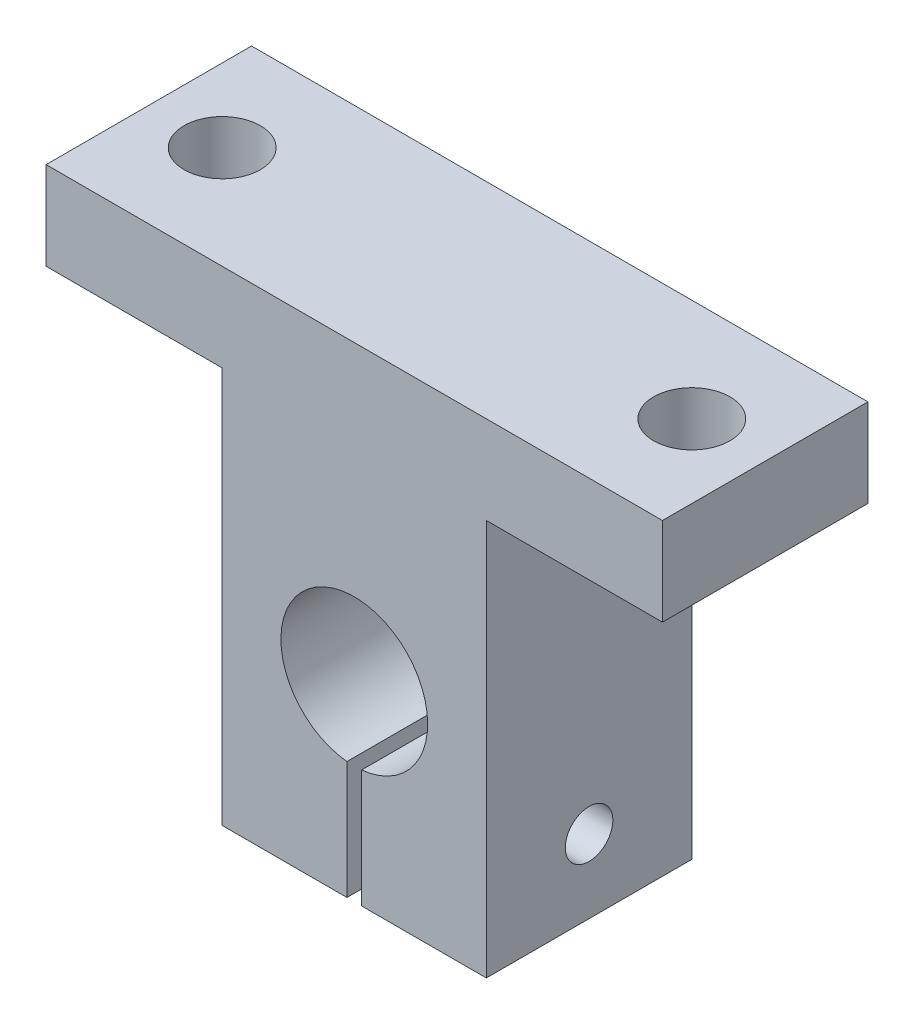
ISO-10303-21;
HEADER;
FILE_DESCRIPTION(('STEP AP214'),'2;1');
FILE_NAME('part.step','',(''),(''),'','','');
FILE_SCHEMA(('AUTOMOTIVE_DESIGN { 1 0 10303 214 1 1 1 1 }'));
ENDSEC;
DATA;
#1=APPLICATION_CONTEXT('core data for automotive mechanical design processes');
#2=APPLICATION_PROTOCOL_DEFINITION('international standard','automotive_design',2000,#1);
#3=PRODUCT_CONTEXT('',#1,'mechanical');
#4=PRODUCT('Part','Part','',(#3));
#5=PRODUCT_RELATED_PRODUCT_CATEGORY('part','',(#4));
#6=PRODUCT_DEFINITION_FORMATION('','',#4);
#7=PRODUCT_DEFINITION_CONTEXT('part definition',#1,'design');
#8=PRODUCT_DEFINITION('design','',#6,#7);
#9=PRODUCT_DEFINITION_SHAPE('','',#8);
#10=(LENGTH_UNIT() NAMED_UNIT(*) SI_UNIT(.MILLI.,.METRE.));
#11=(NAMED_UNIT(*) PLANE_ANGLE_UNIT() SI_UNIT($,.RADIAN.));
#12=(NAMED_UNIT(*) SI_UNIT($,.STERADIAN.) SOLID_ANGLE_UNIT());
#13=UNCERTAINTY_MEASURE_WITH_UNIT(LENGTH_MEASURE(1.E-05),#10,'distance_accuracy_value','');
#14=(GEOMETRIC_REPRESENTATION_CONTEXT(3) GLOBAL_UNCERTAINTY_ASSIGNED_CONTEXT((#13)) GLOBAL_UNIT_ASSIGNED_CONTEXT((#10,
#11,#12)) REPRESENTATION_CONTEXT('',''));
#15=CARTESIAN_POINT('',(0.,0.,0.));
#16=DIRECTION('',(0.,0.,1.));
#17=DIRECTION('',(1.,0.,0.));
#18=AXIS2_PLACEMENT_3D('',#15,#16,#17);
#19=CARTESIAN_POINT('',(-5.99999999999999,-28.,0.));
#20=DIRECTION('',(-1.,0.,0.));
#21=DIRECTION('',(0.,0.,1.));
#22=AXIS2_PLACEMENT_3D('',#19,#20,#21);
#23=PLANE('',#22);
#24=CARTESIAN_POINT('',(-5.99999999999999,-28.,0.));
#25=DIRECTION('',(1.,0.,0.));
#26=DIRECTION('',(0.,0.,-1.));
#27=AXIS2_PLACEMENT_3D('',#24,#25,#26);
#28=CIRCLE('',#27,2.1);
#29=CARTESIAN_POINT('',(-5.99999999999999,-28.,-2.09999999999999));
#30=VERTEX_POINT('',#29);
#31=EDGE_CURVE('E242',#30,#30,#28,.T.);
#32=ORIENTED_EDGE('',*,*,#31,.T.);
#33=EDGE_LOOP('',(#32));
#34=FACE_BOUND('',#33,.T.);
#35=CARTESIAN_POINT('',(-5.99999999999999,-28.,0.));
#36=DIRECTION('',(-1.,0.,0.));
#37=DIRECTION('',(0.,0.,1.));
#38=AXIS2_PLACEMENT_3D('',#35,#36,#37);
#39=CIRCLE('',#38,4.);
#40=CARTESIAN_POINT('',(-5.99999999999999,-28.,4.00000000000001));
#41=VERTEX_POINT('',#40);
#42=EDGE_CURVE('E311',#41,#41,#39,.T.);
#43=ORIENTED_EDGE('',*,*,#42,.T.);
#44=EDGE_LOOP('',(#43));
#45=FACE_BOUND('',#44,.T.);
#46=ADVANCED_FACE('F16',(#34,#45),#23,.T.);
#47=CARTESIAN_POINT('',(3.50000000000001,-28.,0.));
#48=DIRECTION('',(-1.,0.,0.));
#49=DIRECTION('',(0.,0.,1.));
#50=AXIS2_PLACEMENT_3D('',#47,#48,#49);
#51=CYLINDRICAL_SURFACE('',#50,1.621);
#52=CARTESIAN_POINT('',(9.00000000000001,-28.,0.));
#53=DIRECTION('',(-1.,0.,0.));
#54=DIRECTION('',(0.,0.,1.));
#55=AXIS2_PLACEMENT_3D('',#52,#53,#54);
#56=CIRCLE('',#55,1.621);
#57=CARTESIAN_POINT('',(9.00000000000001,-28.,1.62100000000001));
#58=VERTEX_POINT('',#57);
#59=EDGE_CURVE('E227',#58,#58,#56,.T.);
#60=ORIENTED_EDGE('',*,*,#59,.F.);
#61=EDGE_LOOP('',(#60));
#62=FACE_BOUND('',#61,.T.);
#63=CARTESIAN_POINT('',(0.499999999999995,-28.,0.));
#64=DIRECTION('',(-1.,0.,0.));
#65=DIRECTION('',(0.,0.,1.));
#66=AXIS2_PLACEMENT_3D('',#63,#64,#65);
#67=CIRCLE('',#66,1.621);
#68=CARTESIAN_POINT('',(0.499999999999995,-28.,1.62100000000001));
#69=VERTEX_POINT('',#68);
#70=EDGE_CURVE('E118',#69,#69,#67,.T.);
#71=ORIENTED_EDGE('',*,*,#70,.T.);
#72=EDGE_LOOP('',(#71));
#73=FACE_BOUND('',#72,.T.);
#74=ADVANCED_FACE('F511',(#62,#73),#51,.F.);
#75=CARTESIAN_POINT('',(16.,-1.99999999999999,0.));
#76=DIRECTION('',(0.,-1.,0.));
#77=DIRECTION('',(1.,0.,0.));
#78=AXIS2_PLACEMENT_3D('',#75,#76,#77);
#79=CYLINDRICAL_SURFACE('',#78,2.6);
#80=CARTESIAN_POINT('',(16.,-5.99999999999999,0.));
#81=DIRECTION('',(0.,-1.,0.));
#82=DIRECTION('',(1.,0.,0.));
#83=AXIS2_PLACEMENT_3D('',#80,#81,#82);
#84=CIRCLE('',#83,2.6);
#85=CARTESIAN_POINT('',(18.6,-5.99999999999999,0.));
#86=VERTEX_POINT('',#85);
#87=EDGE_CURVE('E216',#86,#86,#84,.F.);
#88=ORIENTED_EDGE('',*,*,#87,.F.);
#89=EDGE_LOOP('',(#88));
#90=FACE_BOUND('',#89,.T.);
#91=CARTESIAN_POINT('',(16.,0.,0.));
#92=DIRECTION('',(0.,-1.,0.));
#93=DIRECTION('',(1.,0.,0.));
#94=AXIS2_PLACEMENT_3D('',#91,#92,#93);
#95=CIRCLE('',#94,2.6);
#96=CARTESIAN_POINT('',(18.6,0.,0.));
#97=VERTEX_POINT('',#96);
#98=EDGE_CURVE('E193',#97,#97,#95,.T.);
#99=ORIENTED_EDGE('',*,*,#98,.F.);
#100=EDGE_LOOP('',(#99));
#101=FACE_BOUND('',#100,.T.);
#102=ADVANCED_FACE('F502',(#90,#101),#79,.F.);
#103=CARTESIAN_POINT('',(-16.,-2.,0.));
#104=DIRECTION('',(0.,-1.,0.));
#105=DIRECTION('',(1.,0.,0.));
#106=AXIS2_PLACEMENT_3D('',#103,#104,#105);
#107=CYLINDRICAL_SURFACE('',#106,2.6);
#108=CARTESIAN_POINT('',(-16.,-6.,0.));
#109=DIRECTION('',(0.,-1.,0.));
#110=DIRECTION('',(1.,0.,0.));
#111=AXIS2_PLACEMENT_3D('',#108,#109,#110);
#112=CIRCLE('',#111,2.6);
#113=CARTESIAN_POINT('',(-13.4,-6.,0.));
#114=VERTEX_POINT('',#113);
#115=EDGE_CURVE('E170',#114,#114,#112,.F.);
#116=ORIENTED_EDGE('',*,*,#115,.F.);
#117=EDGE_LOOP('',(#116));
#118=FACE_BOUND('',#117,.T.);
#119=CARTESIAN_POINT('',(-16.,0.,0.));
#120=DIRECTION('',(0.,-1.,0.));
#121=DIRECTION('',(1.,0.,0.));
#122=AXIS2_PLACEMENT_3D('',#119,#120,#121);
#123=CIRCLE('',#122,2.6);
#124=CARTESIAN_POINT('',(-13.4,0.,0.));
#125=VERTEX_POINT('',#124);
#126=EDGE_CURVE('E261',#125,#125,#123,.T.);
#127=ORIENTED_EDGE('',*,*,#126,.F.);
#128=EDGE_LOOP('',(#127));
#129=FACE_BOUND('',#128,.T.);
#130=ADVANCED_FACE('F321',(#118,#129),#107,.F.);
#131=CARTESIAN_POINT('',(-7.49999999999999,-28.,0.));
#132=DIRECTION('',(-1.,0.,0.));
#133=DIRECTION('',(0.,0.,1.));
#134=AXIS2_PLACEMENT_3D('',#131,#132,#133);
#135=CYLINDRICAL_SURFACE('',#134,4.);
#136=ORIENTED_EDGE('',*,*,#42,.F.);
#137=EDGE_LOOP('',(#136));
#138=FACE_BOUND('',#137,.T.);
#139=CARTESIAN_POINT('',(-8.99999999999999,-28.,0.));
#140=DIRECTION('',(-1.,0.,0.));
#141=DIRECTION('',(0.,0.,1.));
#142=AXIS2_PLACEMENT_3D('',#139,#140,#141);
#143=CIRCLE('',#142,4.);
#144=CARTESIAN_POINT('',(-8.99999999999999,-28.,4.00000000000001));
#145=VERTEX_POINT('',#144);
#146=EDGE_CURVE('E158',#145,#145,#143,.F.);
#147=ORIENTED_EDGE('',*,*,#146,.F.);
#148=EDGE_LOOP('',(#147));
#149=FACE_BOUND('',#148,.T.);
#150=ADVANCED_FACE('F317',(#138,#149),#135,.F.);
#151=CARTESIAN_POINT('',(-5.99999999999999,-28.,0.));
#152=DIRECTION('',(1.,0.,0.));
#153=DIRECTION('',(0.,0.,-1.));
#154=AXIS2_PLACEMENT_3D('',#151,#152,#153);
#155=CYLINDRICAL_SURFACE('',#154,2.1);
#156=CARTESIAN_POINT('',(-0.500000000000002,-28.,0.));
#157=DIRECTION('',(1.,0.,0.));
#158=DIRECTION('',(0.,0.,-1.));
#159=AXIS2_PLACEMENT_3D('',#156,#157,#158);
#160=CIRCLE('',#159,2.1);
#161=CARTESIAN_POINT('',(-0.500000000000002,-28.,-2.09999999999999));
#162=VERTEX_POINT('',#161);
#163=EDGE_CURVE('E145',#162,#162,#160,.T.);
#164=ORIENTED_EDGE('',*,*,#163,.T.);
#165=EDGE_LOOP('',(#164));
#166=FACE_BOUND('',#165,.T.);
#167=ORIENTED_EDGE('',*,*,#31,.F.);
#168=EDGE_LOOP('',(#167));
#169=FACE_BOUND('',#168,.T.);
#170=ADVANCED_FACE('F320',(#166,#169),#155,.F.);
#171=CARTESIAN_POINT('',(0.,-2.99999999999999,-7.));
#172=DIRECTION('',(0.,0.,-1.));
#173=DIRECTION('',(-1.,0.,0.));
#174=AXIS2_PLACEMENT_3D('',#171,#172,#173);
#175=PLANE('',#174);
#176=DIRECTION('',(0.,1.,0.));
#177=VECTOR('',#176,1.);
#178=CARTESIAN_POINT('',(9.00000000000001,-33.,-7.));
#179=LINE('',#178,#177);
#180=CARTESIAN_POINT('',(9.00000000000001,-33.,-7.));
#181=VERTEX_POINT('',#180);
#182=CARTESIAN_POINT('',(8.99999999999999,-5.99999999999999,-7.));
#183=VERTEX_POINT('',#182);
#184=EDGE_CURVE('E234',#181,#183,#179,.T.);
#185=ORIENTED_EDGE('',*,*,#184,.F.);
#186=DIRECTION('',(1.,0.,0.));
#187=VECTOR('',#186,1.);
#188=CARTESIAN_POINT('',(-8.99999999999999,-33.,-7.));
#189=LINE('',#188,#187);
#190=CARTESIAN_POINT('',(0.499999999999999,-33.,-7.));
#191=VERTEX_POINT('',#190);
#192=EDGE_CURVE('E117',#191,#181,#189,.T.);
#193=ORIENTED_EDGE('',*,*,#192,.F.);
#194=DIRECTION('',(0.,1.,0.));
#195=VECTOR('',#194,1.);
#196=CARTESIAN_POINT('',(0.499999999999995,-20.,-7.));
#197=LINE('',#196,#195);
#198=CARTESIAN_POINT('',(0.499999999999998,-24.9749371855331,-7.));
#199=VERTEX_POINT('',#198);
#200=EDGE_CURVE('E53',#191,#199,#197,.T.);
#201=ORIENTED_EDGE('',*,*,#200,.T.);
#202=CARTESIAN_POINT('',(0.,-20.,-7.));
#203=DIRECTION('',(0.,0.,-1.));
#204=DIRECTION('',(-1.,0.,0.));
#205=AXIS2_PLACEMENT_3D('',#202,#203,#204);
#206=CIRCLE('',#205,5.);
#207=CARTESIAN_POINT('',(-0.500000000000001,-24.9749371855331,-7.));
#208=VERTEX_POINT('',#207);
#209=EDGE_CURVE('E141',#199,#208,#206,.F.);
#210=ORIENTED_EDGE('',*,*,#209,.T.);
#211=DIRECTION('',(0.,-1.,0.));
#212=VECTOR('',#211,1.);
#213=CARTESIAN_POINT('',(-0.500000000000001,-33.,-7.));
#214=LINE('',#213,#212);
#215=CARTESIAN_POINT('',(-0.500000000000001,-33.,-7.));
#216=VERTEX_POINT('',#215);
#217=EDGE_CURVE('E59',#208,#216,#214,.T.);
#218=ORIENTED_EDGE('',*,*,#217,.T.);
#219=DIRECTION('',(1.,0.,0.));
#220=VECTOR('',#219,1.);
#221=CARTESIAN_POINT('',(-8.99999999999999,-33.,-7.));
#222=LINE('',#221,#220);
#223=CARTESIAN_POINT('',(-8.99999999999999,-33.,-7.));
#224=VERTEX_POINT('',#223);
#225=EDGE_CURVE('E157',#224,#216,#222,.T.);
#226=ORIENTED_EDGE('',*,*,#225,.F.);
#227=DIRECTION('',(0.,1.,0.));
#228=VECTOR('',#227,1.);
#229=CARTESIAN_POINT('',(-8.99999999999999,-6.,-7.));
#230=LINE('',#229,#228);
#231=CARTESIAN_POINT('',(-8.99999999999999,-6.,-7.));
#232=VERTEX_POINT('',#231);
#233=EDGE_CURVE('E169',#232,#224,#230,.F.);
#234=ORIENTED_EDGE('',*,*,#233,.F.);
#235=DIRECTION('',(1.,0.,0.));
#236=VECTOR('',#235,1.);
#237=CARTESIAN_POINT('',(-21.,-6.,-7.));
#238=LINE('',#237,#236);
#239=CARTESIAN_POINT('',(-21.,-6.,-7.));
#240=VERTEX_POINT('',#239);
#241=EDGE_CURVE('E181',#240,#232,#238,.T.);
#242=ORIENTED_EDGE('',*,*,#241,.F.);
#243=DIRECTION('',(0.,1.,0.));
#244=VECTOR('',#243,1.);
#245=CARTESIAN_POINT('',(-21.,0.,-7.));
#246=LINE('',#245,#244);
#247=CARTESIAN_POINT('',(-21.,0.,-7.));
#248=VERTEX_POINT('',#247);
#249=EDGE_CURVE('E182',#248,#240,#246,.F.);
#250=ORIENTED_EDGE('',*,*,#249,.F.);
#251=DIRECTION('',(-1.,0.,0.));
#252=VECTOR('',#251,1.);
#253=CARTESIAN_POINT('',(21.,0.,-7.));
#254=LINE('',#253,#252);
#255=CARTESIAN_POINT('',(21.,0.,-7.));
#256=VERTEX_POINT('',#255);
#257=EDGE_CURVE('E204',#256,#248,#254,.T.);
#258=ORIENTED_EDGE('',*,*,#257,.F.);
#259=DIRECTION('',(0.,1.,0.));
#260=VECTOR('',#259,1.);
#261=CARTESIAN_POINT('',(21.,-5.99999999999999,-7.));
#262=LINE('',#261,#260);
#263=CARTESIAN_POINT('',(21.,-5.99999999999999,-7.));
#264=VERTEX_POINT('',#263);
#265=EDGE_CURVE('E205',#264,#256,#262,.T.);
#266=ORIENTED_EDGE('',*,*,#265,.F.);
#267=DIRECTION('',(1.,0.,0.));
#268=VECTOR('',#267,1.);
#269=CARTESIAN_POINT('',(-21.,-6.,-7.));
#270=LINE('',#269,#268);
#271=EDGE_CURVE('E226',#183,#264,#270,.T.);
#272=ORIENTED_EDGE('',*,*,#271,.F.);
#273=EDGE_LOOP('',(#185,#193,#201,#210,#218,#226,#234,#242,#250,#258,#266,#272));
#274=FACE_BOUND('',#273,.T.);
#275=ADVANCED_FACE('F338',(#274),#175,.T.);
#276=CARTESIAN_POINT('',(0.499999999999995,-20.,7.));
#277=DIRECTION('',(1.,0.,0.));
#278=DIRECTION('',(0.,1.,0.));
#279=AXIS2_PLACEMENT_3D('',#276,#277,#278);
#280=PLANE('',#279);
#281=ORIENTED_EDGE('',*,*,#70,.F.);
#282=EDGE_LOOP('',(#281));
#283=FACE_BOUND('',#282,.T.);
#284=ORIENTED_EDGE('',*,*,#200,.F.);
#285=DIRECTION('',(0.,0.,1.));
#286=VECTOR('',#285,1.);
#287=CARTESIAN_POINT('',(0.499999999999999,-33.,0.));
#288=LINE('',#287,#286);
#289=CARTESIAN_POINT('',(0.499999999999998,-33.,7.));
#290=VERTEX_POINT('',#289);
#291=EDGE_CURVE('E110',#290,#191,#288,.F.);
#292=ORIENTED_EDGE('',*,*,#291,.F.);
#293=DIRECTION('',(0.,1.,0.));
#294=VECTOR('',#293,1.);
#295=CARTESIAN_POINT('',(0.499999999999997,-2.99999999999999,7.));
#296=LINE('',#295,#294);
#297=CARTESIAN_POINT('',(0.499999999999998,-24.9749371855331,7.));
#298=VERTEX_POINT('',#297);
#299=EDGE_CURVE('E114',#298,#290,#296,.F.);
#300=ORIENTED_EDGE('',*,*,#299,.F.);
#301=DIRECTION('',(0.,0.,-1.));
#302=VECTOR('',#301,1.);
#303=CARTESIAN_POINT('',(0.499999999999999,-24.9749371855331,7.));
#304=LINE('',#303,#302);
#305=EDGE_CURVE('E132',#298,#199,#304,.T.);
#306=ORIENTED_EDGE('',*,*,#305,.T.);
#307=EDGE_LOOP('',(#284,#292,#300,#306));
#308=FACE_BOUND('',#307,.T.);
#309=ADVANCED_FACE('F112',(#283,#308),#280,.F.);
#310=CARTESIAN_POINT('',(-8.99999999999999,-33.,0.));
#311=DIRECTION('',(0.,-1.,0.));
#312=DIRECTION('',(1.,0.,0.));
#313=AXIS2_PLACEMENT_3D('',#310,#311,#312);
#314=PLANE('',#313);
#315=DIRECTION('',(0.,0.,1.));
#316=VECTOR('',#315,1.);
#317=CARTESIAN_POINT('',(9.00000000000001,-33.,0.));
#318=LINE('',#317,#316);
#319=CARTESIAN_POINT('',(9.00000000000001,-33.,7.));
#320=VERTEX_POINT('',#319);
#321=EDGE_CURVE('E124',#320,#181,#318,.F.);
#322=ORIENTED_EDGE('',*,*,#321,.F.);
#323=DIRECTION('',(1.,0.,0.));
#324=VECTOR('',#323,1.);
#325=CARTESIAN_POINT('',(0.,-33.,7.));
#326=LINE('',#325,#324);
#327=EDGE_CURVE('E121',#290,#320,#326,.T.);
#328=ORIENTED_EDGE('',*,*,#327,.F.);
#329=ORIENTED_EDGE('',*,*,#291,.T.);
#330=ORIENTED_EDGE('',*,*,#192,.T.);
#331=EDGE_LOOP('',(#322,#328,#329,#330));
#332=FACE_BOUND('',#331,.T.);
#333=ADVANCED_FACE('F122',(#332),#314,.T.);
#334=CARTESIAN_POINT('',(9.00000000000001,-33.,0.));
#335=DIRECTION('',(1.,0.,0.));
#336=DIRECTION('',(0.,1.,0.));
#337=AXIS2_PLACEMENT_3D('',#334,#335,#336);
#338=PLANE('',#337);
#339=ORIENTED_EDGE('',*,*,#59,.T.);
#340=EDGE_LOOP('',(#339));
#341=FACE_BOUND('',#340,.T.);
#342=ORIENTED_EDGE('',*,*,#321,.T.);
#343=ORIENTED_EDGE('',*,*,#184,.T.);
#344=DIRECTION('',(0.,0.,1.));
#345=VECTOR('',#344,1.);
#346=CARTESIAN_POINT('',(8.99999999999999,-5.99999999999999,0.));
#347=LINE('',#346,#345);
#348=CARTESIAN_POINT('',(9.00000000000001,-5.99999999999999,7.));
#349=VERTEX_POINT('',#348);
#350=EDGE_CURVE('E223',#349,#183,#347,.F.);
#351=ORIENTED_EDGE('',*,*,#350,.F.);
#352=DIRECTION('',(0.,1.,0.));
#353=VECTOR('',#352,1.);
#354=CARTESIAN_POINT('',(9.00000000000001,-2.99999999999999,7.));
#355=LINE('',#354,#353);
#356=EDGE_CURVE('E128',#320,#349,#355,.T.);
#357=ORIENTED_EDGE('',*,*,#356,.F.);
#358=EDGE_LOOP('',(#342,#343,#351,#357));
#359=FACE_BOUND('',#358,.T.);
#360=ADVANCED_FACE('F358',(#341,#359),#338,.T.);
#361=CARTESIAN_POINT('',(-21.,-6.,0.));
#362=DIRECTION('',(0.,-1.,0.));
#363=DIRECTION('',(1.,0.,0.));
#364=AXIS2_PLACEMENT_3D('',#361,#362,#363);
#365=PLANE('',#364);
#366=ORIENTED_EDGE('',*,*,#87,.T.);
#367=EDGE_LOOP('',(#366));
#368=FACE_BOUND('',#367,.T.);
#369=DIRECTION('',(0.,0.,-1.));
#370=VECTOR('',#369,1.);
#371=CARTESIAN_POINT('',(21.,-5.99999999999999,0.));
#372=LINE('',#371,#370);
#373=CARTESIAN_POINT('',(21.,-5.99999999999999,7.));
#374=VERTEX_POINT('',#373);
#375=EDGE_CURVE('E213',#374,#264,#372,.T.);
#376=ORIENTED_EDGE('',*,*,#375,.F.);
#377=DIRECTION('',(1.,0.,0.));
#378=VECTOR('',#377,1.);
#379=CARTESIAN_POINT('',(0.,-5.99999999999999,7.));
#380=LINE('',#379,#378);
#381=EDGE_CURVE('E210',#349,#374,#380,.T.);
#382=ORIENTED_EDGE('',*,*,#381,.F.);
#383=ORIENTED_EDGE('',*,*,#350,.T.);
#384=ORIENTED_EDGE('',*,*,#271,.T.);
#385=EDGE_LOOP('',(#376,#382,#383,#384));
#386=FACE_BOUND('',#385,.T.);
#387=ADVANCED_FACE('F356',(#368,#386),#365,.T.);
#388=CARTESIAN_POINT('',(21.,-5.99999999999999,0.));
#389=DIRECTION('',(1.,0.,0.));
#390=DIRECTION('',(0.,0.,-1.));
#391=AXIS2_PLACEMENT_3D('',#388,#389,#390);
#392=PLANE('',#391);
#393=ORIENTED_EDGE('',*,*,#375,.T.);
#394=ORIENTED_EDGE('',*,*,#265,.T.);
#395=DIRECTION('',(0.,0.,1.));
#396=VECTOR('',#395,1.);
#397=CARTESIAN_POINT('',(21.,0.,0.));
#398=LINE('',#397,#396);
#399=CARTESIAN_POINT('',(21.,0.,7.));
#400=VERTEX_POINT('',#399);
#401=EDGE_CURVE('E201',#400,#256,#398,.F.);
#402=ORIENTED_EDGE('',*,*,#401,.F.);
#403=DIRECTION('',(0.,1.,0.));
#404=VECTOR('',#403,1.);
#405=CARTESIAN_POINT('',(21.,-2.99999999999999,7.));
#406=LINE('',#405,#404);
#407=EDGE_CURVE('E198',#374,#400,#406,.T.);
#408=ORIENTED_EDGE('',*,*,#407,.F.);
#409=EDGE_LOOP('',(#393,#394,#402,#408));
#410=FACE_BOUND('',#409,.T.);
#411=ADVANCED_FACE('F353',(#410),#392,.T.);
#412=CARTESIAN_POINT('',(21.,0.,0.));
#413=DIRECTION('',(0.,1.,0.));
#414=DIRECTION('',(-1.,0.,0.));
#415=AXIS2_PLACEMENT_3D('',#412,#413,#414);
#416=PLANE('',#415);
#417=ORIENTED_EDGE('',*,*,#98,.T.);
#418=EDGE_LOOP('',(#417));
#419=FACE_BOUND('',#418,.T.);
#420=ORIENTED_EDGE('',*,*,#126,.T.);
#421=EDGE_LOOP('',(#420));
#422=FACE_BOUND('',#421,.T.);
#423=ORIENTED_EDGE('',*,*,#401,.T.);
#424=ORIENTED_EDGE('',*,*,#257,.T.);
#425=DIRECTION('',(0.,0.,1.));
#426=VECTOR('',#425,1.);
#427=CARTESIAN_POINT('',(-21.,0.,0.));
#428=LINE('',#427,#426);
#429=CARTESIAN_POINT('',(-21.,0.,7.));
#430=VERTEX_POINT('',#429);
#431=EDGE_CURVE('E190',#430,#248,#428,.F.);
#432=ORIENTED_EDGE('',*,*,#431,.F.);
#433=DIRECTION('',(1.,0.,0.));
#434=VECTOR('',#433,1.);
#435=CARTESIAN_POINT('',(0.,0.,7.));
#436=LINE('',#435,#434);
#437=EDGE_CURVE('E187',#400,#430,#436,.F.);
#438=ORIENTED_EDGE('',*,*,#437,.F.);
#439=EDGE_LOOP('',(#423,#424,#432,#438));
#440=FACE_BOUND('',#439,.T.);
#441=ADVANCED_FACE('F350',(#419,#422,#440),#416,.T.);
#442=CARTESIAN_POINT('',(-21.,0.,0.));
#443=DIRECTION('',(-1.,0.,0.));
#444=DIRECTION('',(0.,0.,1.));
#445=AXIS2_PLACEMENT_3D('',#442,#443,#444);
#446=PLANE('',#445);
#447=ORIENTED_EDGE('',*,*,#431,.T.);
#448=ORIENTED_EDGE('',*,*,#249,.T.);
#449=DIRECTION('',(0.,0.,1.));
#450=VECTOR('',#449,1.);
#451=CARTESIAN_POINT('',(-21.,-6.,0.));
#452=LINE('',#451,#450);
#453=CARTESIAN_POINT('',(-21.,-6.,7.));
#454=VERTEX_POINT('',#453);
#455=EDGE_CURVE('E178',#454,#240,#452,.F.);
#456=ORIENTED_EDGE('',*,*,#455,.F.);
#457=DIRECTION('',(0.,1.,0.));
#458=VECTOR('',#457,1.);
#459=CARTESIAN_POINT('',(-21.,-2.99999999999999,7.));
#460=LINE('',#459,#458);
#461=EDGE_CURVE('E175',#430,#454,#460,.F.);
#462=ORIENTED_EDGE('',*,*,#461,.F.);
#463=EDGE_LOOP('',(#447,#448,#456,#462));
#464=FACE_BOUND('',#463,.T.);
#465=ADVANCED_FACE('F345',(#464),#446,.T.);
#466=CARTESIAN_POINT('',(-21.,-6.,0.));
#467=DIRECTION('',(0.,-1.,0.));
#468=DIRECTION('',(1.,0.,0.));
#469=AXIS2_PLACEMENT_3D('',#466,#467,#468);
#470=PLANE('',#469);
#471=ORIENTED_EDGE('',*,*,#115,.T.);
#472=EDGE_LOOP('',(#471));
#473=FACE_BOUND('',#472,.T.);
#474=ORIENTED_EDGE('',*,*,#455,.T.);
#475=ORIENTED_EDGE('',*,*,#241,.T.);
#476=DIRECTION('',(0.,0.,1.));
#477=VECTOR('',#476,1.);
#478=CARTESIAN_POINT('',(-8.99999999999999,-6.,0.));
#479=LINE('',#478,#477);
#480=CARTESIAN_POINT('',(-8.99999999999999,-6.,7.));
#481=VERTEX_POINT('',#480);
#482=EDGE_CURVE('E166',#481,#232,#479,.F.);
#483=ORIENTED_EDGE('',*,*,#482,.F.);
#484=DIRECTION('',(1.,0.,0.));
#485=VECTOR('',#484,1.);
#486=CARTESIAN_POINT('',(0.,-6.,7.));
#487=LINE('',#486,#485);
#488=EDGE_CURVE('E163',#454,#481,#487,.T.);
#489=ORIENTED_EDGE('',*,*,#488,.F.);
#490=EDGE_LOOP('',(#474,#475,#483,#489));
#491=FACE_BOUND('',#490,.T.);
#492=ADVANCED_FACE('F329',(#473,#491),#470,.T.);
#493=CARTESIAN_POINT('',(-8.99999999999999,-6.,0.));
#494=DIRECTION('',(-1.,0.,0.));
#495=DIRECTION('',(0.,0.,1.));
#496=AXIS2_PLACEMENT_3D('',#493,#494,#495);
#497=PLANE('',#496);
#498=ORIENTED_EDGE('',*,*,#146,.T.);
#499=EDGE_LOOP('',(#498));
#500=FACE_BOUND('',#499,.T.);
#501=ORIENTED_EDGE('',*,*,#482,.T.);
#502=ORIENTED_EDGE('',*,*,#233,.T.);
#503=DIRECTION('',(0.,0.,1.));
#504=VECTOR('',#503,1.);
#505=CARTESIAN_POINT('',(-8.99999999999999,-33.,0.));
#506=LINE('',#505,#504);
#507=CARTESIAN_POINT('',(-8.99999999999999,-33.,7.));
#508=VERTEX_POINT('',#507);
#509=EDGE_CURVE('E154',#508,#224,#506,.F.);
#510=ORIENTED_EDGE('',*,*,#509,.F.);
#511=DIRECTION('',(0.,1.,0.));
#512=VECTOR('',#511,1.);
#513=CARTESIAN_POINT('',(-8.99999999999999,-2.99999999999999,7.));
#514=LINE('',#513,#512);
#515=EDGE_CURVE('E151',#481,#508,#514,.F.);
#516=ORIENTED_EDGE('',*,*,#515,.F.);
#517=EDGE_LOOP('',(#501,#502,#510,#516));
#518=FACE_BOUND('',#517,.T.);
#519=ADVANCED_FACE('F325',(#500,#518),#497,.T.);
#520=CARTESIAN_POINT('',(-8.99999999999999,-33.,0.));
#521=DIRECTION('',(0.,-1.,0.));
#522=DIRECTION('',(1.,0.,0.));
#523=AXIS2_PLACEMENT_3D('',#520,#521,#522);
#524=PLANE('',#523);
#525=ORIENTED_EDGE('',*,*,#509,.T.);
#526=ORIENTED_EDGE('',*,*,#225,.T.);
#527=DIRECTION('',(0.,0.,1.));
#528=VECTOR('',#527,1.);
#529=CARTESIAN_POINT('',(-0.500000000000001,-33.,7.));
#530=LINE('',#529,#528);
#531=CARTESIAN_POINT('',(-0.500000000000001,-33.,7.));
#532=VERTEX_POINT('',#531);
#533=EDGE_CURVE('E143',#216,#532,#530,.T.);
#534=ORIENTED_EDGE('',*,*,#533,.T.);
#535=DIRECTION('',(1.,0.,0.));
#536=VECTOR('',#535,1.);
#537=CARTESIAN_POINT('',(0.,-33.,7.));
#538=LINE('',#537,#536);
#539=EDGE_CURVE('E148',#508,#532,#538,.T.);
#540=ORIENTED_EDGE('',*,*,#539,.F.);
#541=EDGE_LOOP('',(#525,#526,#534,#540));
#542=FACE_BOUND('',#541,.T.);
#543=ADVANCED_FACE('F328',(#542),#524,.T.);
#544=CARTESIAN_POINT('',(-0.500000000000001,-33.,7.));
#545=DIRECTION('',(-1.,0.,0.));
#546=DIRECTION('',(0.,-1.,0.));
#547=AXIS2_PLACEMENT_3D('',#544,#545,#546);
#548=PLANE('',#547);
#549=ORIENTED_EDGE('',*,*,#163,.F.);
#550=EDGE_LOOP('',(#549));
#551=FACE_BOUND('',#550,.T.);
#552=DIRECTION('',(0.,1.,0.));
#553=VECTOR('',#552,1.);
#554=CARTESIAN_POINT('',(-0.500000000000001,-2.99999999999999,7.));
#555=LINE('',#554,#553);
#556=CARTESIAN_POINT('',(-0.500000000000001,-24.9749371855331,7.));
#557=VERTEX_POINT('',#556);
#558=EDGE_CURVE('E25',#532,#557,#555,.T.);
#559=ORIENTED_EDGE('',*,*,#558,.F.);
#560=ORIENTED_EDGE('',*,*,#533,.F.);
#561=ORIENTED_EDGE('',*,*,#217,.F.);
#562=DIRECTION('',(0.,0.,-1.));
#563=VECTOR('',#562,1.);
#564=CARTESIAN_POINT('',(-0.5,-24.9749371855331,7.));
#565=LINE('',#564,#563);
#566=EDGE_CURVE('E34',#208,#557,#565,.F.);
#567=ORIENTED_EDGE('',*,*,#566,.T.);
#568=EDGE_LOOP('',(#559,#560,#561,#567));
#569=FACE_BOUND('',#568,.T.);
#570=ADVANCED_FACE('F376',(#551,#569),#548,.F.);
#571=CARTESIAN_POINT('',(0.,-20.,7.));
#572=DIRECTION('',(0.,0.,-1.));
#573=DIRECTION('',(-1.,0.,0.));
#574=AXIS2_PLACEMENT_3D('',#571,#572,#573);
#575=CYLINDRICAL_SURFACE('',#574,5.);
#576=CARTESIAN_POINT('',(0.,-20.,7.));
#577=DIRECTION('',(0.,0.,-1.));
#578=DIRECTION('',(-1.,0.,0.));
#579=AXIS2_PLACEMENT_3D('',#576,#577,#578);
#580=CIRCLE('',#579,5.);
#581=EDGE_CURVE('E11',#557,#298,#580,.T.);
#582=ORIENTED_EDGE('',*,*,#581,.F.);
#583=ORIENTED_EDGE('',*,*,#566,.F.);
#584=ORIENTED_EDGE('',*,*,#209,.F.);
#585=ORIENTED_EDGE('',*,*,#305,.F.);
#586=EDGE_LOOP('',(#582,#583,#584,#585));
#587=FACE_BOUND('',#586,.T.);
#588=ADVANCED_FACE('F371',(#587),#575,.F.);
#589=CARTESIAN_POINT('',(0.,-2.99999999999999,7.));
#590=DIRECTION('',(0.,0.,1.));
#591=DIRECTION('',(1.,0.,0.));
#592=AXIS2_PLACEMENT_3D('',#589,#590,#591);
#593=PLANE('',#592);
#594=ORIENTED_EDGE('',*,*,#558,.T.);
#595=ORIENTED_EDGE('',*,*,#581,.T.);
#596=ORIENTED_EDGE('',*,*,#299,.T.);
#597=ORIENTED_EDGE('',*,*,#327,.T.);
#598=ORIENTED_EDGE('',*,*,#356,.T.);
#599=ORIENTED_EDGE('',*,*,#381,.T.);
#600=ORIENTED_EDGE('',*,*,#407,.T.);
#601=ORIENTED_EDGE('',*,*,#437,.T.);
#602=ORIENTED_EDGE('',*,*,#461,.T.);
#603=ORIENTED_EDGE('',*,*,#488,.T.);
#604=ORIENTED_EDGE('',*,*,#515,.T.);
#605=ORIENTED_EDGE('',*,*,#539,.T.);
#606=EDGE_LOOP('',(#594,#595,#596,#597,#598,#599,#600,#601,#602,#603,#604,#605));
#607=FACE_BOUND('',#606,.T.);
#608=ADVANCED_FACE('F131',(#607),#593,.T.);
#609=CLOSED_SHELL('',(#46,#74,#102,#130,#150,#170,#275,#309,#333,#360,#387,#411,#441,#465,#492,
#519,#543,#570,#588,#608));
#610=MANIFOLD_SOLID_BREP('B1',#609);
#611=ADVANCED_BREP_SHAPE_REPRESENTATION('',(#18,#610),#14);
#612=SHAPE_DEFINITION_REPRESENTATION(#9,#611);
ENDSEC;
END-ISO-10303-21;
